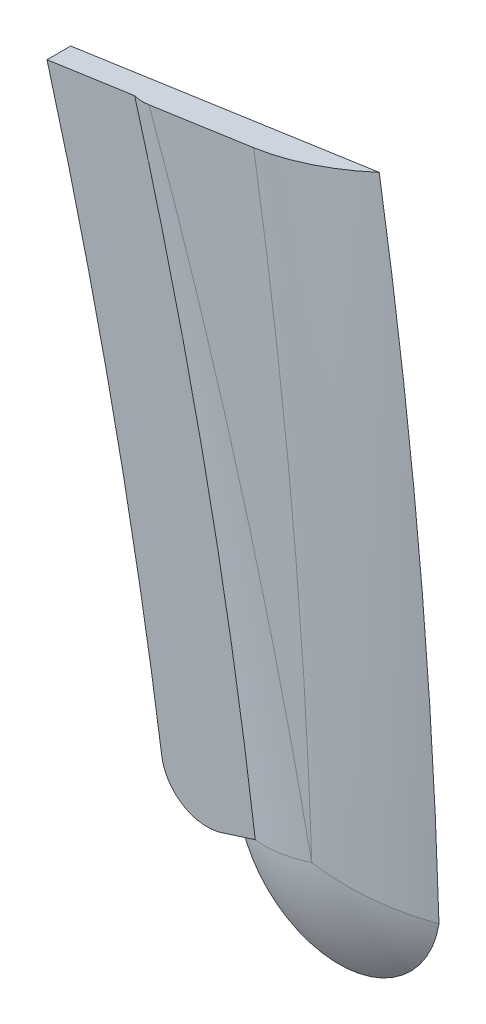
ISO-10303-21;
HEADER;
FILE_DESCRIPTION(('STEP AP214'),'2;1');
FILE_NAME('part.step','',(''),(''),'','','');
FILE_SCHEMA(('AUTOMOTIVE_DESIGN { 1 0 10303 214 1 1 1 1 }'));
ENDSEC;
DATA;
#1=APPLICATION_CONTEXT('core data for automotive mechanical design processes');
#2=APPLICATION_PROTOCOL_DEFINITION('international standard','automotive_design',2000,#1);
#3=PRODUCT_CONTEXT('',#1,'mechanical');
#4=PRODUCT('Part','Part','',(#3));
#5=PRODUCT_RELATED_PRODUCT_CATEGORY('part','',(#4));
#6=PRODUCT_DEFINITION_FORMATION('','',#4);
#7=PRODUCT_DEFINITION_CONTEXT('part definition',#1,'design');
#8=PRODUCT_DEFINITION('design','',#6,#7);
#9=PRODUCT_DEFINITION_SHAPE('','',#8);
#10=(LENGTH_UNIT() NAMED_UNIT(*) SI_UNIT(.MILLI.,.METRE.));
#11=(NAMED_UNIT(*) PLANE_ANGLE_UNIT() SI_UNIT($,.RADIAN.));
#12=(NAMED_UNIT(*) SI_UNIT($,.STERADIAN.) SOLID_ANGLE_UNIT());
#13=UNCERTAINTY_MEASURE_WITH_UNIT(LENGTH_MEASURE(1.E-05),#10,'distance_accuracy_value','');
#14=(GEOMETRIC_REPRESENTATION_CONTEXT(3) GLOBAL_UNCERTAINTY_ASSIGNED_CONTEXT((#13)) GLOBAL_UNIT_ASSIGNED_CONTEXT((#10,
#11,#12)) REPRESENTATION_CONTEXT('',''));
#15=CARTESIAN_POINT('',(0.,0.,0.));
#16=DIRECTION('',(0.,0.,1.));
#17=DIRECTION('',(1.,0.,0.));
#18=AXIS2_PLACEMENT_3D('',#15,#16,#17);
#19=CARTESIAN_POINT('',(-48.2139683042671,59.2531194314504,19.5));
#20=DIRECTION('',(0.,0.,-1.));
#21=DIRECTION('',(-1.,0.,0.));
#22=AXIS2_PLACEMENT_3D('',#19,#20,#21);
#23=PLANE('',#22);
#24=CARTESIAN_POINT('',(3.68415384016695,71.5736374912152,19.5));
#25=CARTESIAN_POINT('',(4.29468394155968,68.0185127590476,19.5));
#26=CARTESIAN_POINT('',(4.86906082283439,64.4571793651101,19.5));
#27=CARTESIAN_POINT('',(5.94508286996195,57.3235857148436,19.5));
#28=CARTESIAN_POINT('',(6.44672889729395,53.7513255884509,19.5));
#29=CARTESIAN_POINT('',(7.37687952526408,46.597276335214,19.5));
#30=CARTESIAN_POINT('',(7.80538395609168,43.0154871862663,19.5));
#31=CARTESIAN_POINT('',(8.58897757477725,35.843880383743,19.5));
#32=CARTESIAN_POINT('',(8.94406588388377,32.2540626345892,19.5));
#33=CARTESIAN_POINT('',(9.71136154316885,23.5922532149798,19.5));
#34=CARTESIAN_POINT('',(10.0871455716584,18.5169669450999,19.5));
#35=CARTESIAN_POINT('',(10.5409186123509,10.8975237956368,19.5));
#36=CARTESIAN_POINT('',(10.6738627641399,8.35650507549414,19.5));
#37=CARTESIAN_POINT('',(10.9031553748031,3.27283883682254,19.5));
#38=CARTESIAN_POINT('',(10.9995041494278,0.730191332536591,19.5));
#39=CARTESIAN_POINT('',(11.077581474908,-1.8130605800072,19.5));
#40=B_SPLINE_CURVE_WITH_KNOTS('',3,(#24,#25,#26,#27,#28,#29,#30,#31,#32,#33,#34,#35,#36,#37,#38,
#39),.UNSPECIFIED.,.F.,.F.,(4,2,2,2,2,2,2,4),(0.,10.8213143921703,21.6425005980503,
32.4637119267951,43.2850527721182,58.5501541199577,66.1834171449468,73.8166143074898),.UNSPECIFIED.);
#41=CARTESIAN_POINT('',(4.46374999870839,66.9098005966364,19.5));
#42=VERTEX_POINT('',#41);
#43=CARTESIAN_POINT('',(11.077581474908,-1.81306058000721,19.5));
#44=VERTEX_POINT('',#43);
#45=EDGE_CURVE('E188',#42,#44,#40,.T.);
#46=ORIENTED_EDGE('',*,*,#45,.T.);
#47=CARTESIAN_POINT('',(0.,0.,19.5));
#48=DIRECTION('',(0.,0.,-1.));
#49=DIRECTION('',(-1.,0.,0.));
#50=AXIS2_PLACEMENT_3D('',#47,#48,#49);
#51=CIRCLE('',#50,11.2249721603218);
#52=CARTESIAN_POINT('',(-10.7037577239821,-3.38076479310439,19.5));
#53=VERTEX_POINT('',#52);
#54=EDGE_CURVE('E138',#44,#53,#51,.T.);
#55=ORIENTED_EDGE('',*,*,#54,.T.);
#56=DIRECTION('',(-0.953566527480385,-0.301182465739626,0.));
#57=VECTOR('',#56,1.);
#58=CARTESIAN_POINT('',(0.,0.,19.5));
#59=LINE('',#58,#57);
#60=CARTESIAN_POINT('',(-11.5710273617748,-3.65469052397259,19.5));
#61=VERTEX_POINT('',#60);
#62=EDGE_CURVE('E232',#53,#61,#59,.T.);
#63=ORIENTED_EDGE('',*,*,#62,.T.);
#64=CARTESIAN_POINT('',(-13.0769396904729,1.11314211342933,19.5));
#65=DIRECTION('',(0.,0.,-1.));
#66=DIRECTION('',(-1.,0.,0.));
#67=AXIS2_PLACEMENT_3D('',#64,#65,#66);
#68=CIRCLE('',#67,5.);
#69=CARTESIAN_POINT('',(-18.0383502726661,0.493138053038172,19.5));
#70=VERTEX_POINT('',#69);
#71=EDGE_CURVE('E231',#70,#61,#68,.F.);
#72=ORIENTED_EDGE('',*,*,#71,.F.);
#73=CARTESIAN_POINT('',(-32.2537464639421,71.5736374912152,19.5));
#74=CARTESIAN_POINT('',(-31.7196254949367,69.6460921472136,19.5));
#75=CARTESIAN_POINT('',(-31.197055590972,67.7153650418235,19.5));
#76=CARTESIAN_POINT('',(-30.1751297554586,63.8477248027204,19.5));
#77=CARTESIAN_POINT('',(-29.6757744128374,61.9108115134015,19.5));
#78=CARTESIAN_POINT('',(-28.2125053871962,56.0902811987708,19.5));
#79=CARTESIAN_POINT('',(-27.2836433301346,52.1977923928441,19.5));
#80=CARTESIAN_POINT('',(-25.5202631430093,44.3913284732164,19.5));
#81=CARTESIAN_POINT('',(-24.6857494838729,40.4773523504945,19.5));
#82=CARTESIAN_POINT('',(-23.2999114318166,33.5683181958468,19.5));
#83=CARTESIAN_POINT('',(-22.7285791310125,30.5772589183038,19.5));
#84=CARTESIAN_POINT('',(-21.6411408924349,24.585056475485,19.5));
#85=CARTESIAN_POINT('',(-21.125035864776,21.58391314487,19.5));
#86=CARTESIAN_POINT('',(-20.1481588642637,15.5723653523408,19.5));
#87=CARTESIAN_POINT('',(-19.6873917913945,12.5619600944849,19.5));
#88=CARTESIAN_POINT('',(-18.8212901107604,6.53323727375859,19.5));
#89=CARTESIAN_POINT('',(-18.4159545734614,3.51491984443301,19.5));
#90=CARTESIAN_POINT('',(-18.0383502726661,0.493138053038171,19.5));
#91=B_SPLINE_CURVE_WITH_KNOTS('',3,(#73,#74,#75,#76,#77,#78,#79,#80,#81,#82,#83,#84,#85,#86,#87,
#88,#89,#90),.UNSPECIFIED.,.F.,.F.,(4,2,2,2,2,2,2,2,4),(0.,6.00046418462588,12.0010805113668,
24.0051723099705,36.0098327133338,45.1447495504336,54.2798169026959,63.4156925380838,
72.5514149547519),.UNSPECIFIED.);
#92=CARTESIAN_POINT('',(-29.6888480735039,61.9457367984052,19.5));
#93=VERTEX_POINT('',#92);
#94=EDGE_CURVE('E68',#93,#70,#91,.T.);
#95=ORIENTED_EDGE('',*,*,#94,.F.);
#96=DIRECTION('',(0.989601238153556,0.143838066745033,0.));
#97=VECTOR('',#96,1.);
#98=CARTESIAN_POINT('',(-48.2139683042671,59.2531194314504,19.5));
#99=LINE('',#98,#97);
#100=EDGE_CURVE('E11',#93,#42,#99,.T.);
#101=ORIENTED_EDGE('',*,*,#100,.T.);
#102=EDGE_LOOP('',(#46,#55,#63,#72,#95,#101));
#103=FACE_BOUND('',#102,.T.);
#104=ADVANCED_FACE('F42',(#103),#23,.T.);
#105=CARTESIAN_POINT('',(-48.2139683042671,59.2531194314504,19.5));
#106=DIRECTION('',(0.143838066745033,-0.989601238153556,0.));
#107=DIRECTION('',(0.989601238153556,0.143838066745033,0.));
#108=AXIS2_PLACEMENT_3D('',#105,#106,#107);
#109=PLANE('',#108);
#110=ORIENTED_EDGE('',*,*,#100,.F.);
#111=DIRECTION('',(0.,0.,1.));
#112=VECTOR('',#111,1.);
#113=CARTESIAN_POINT('',(-29.6888480735039,61.9457367984052,19.121468009726));
#114=LINE('',#113,#112);
#115=CARTESIAN_POINT('',(-29.688848073504,61.9457367984058,22.121468009726));
#116=VERTEX_POINT('',#115);
#117=EDGE_CURVE('E53',#93,#116,#114,.T.);
#118=ORIENTED_EDGE('',*,*,#117,.T.);
#119=CARTESIAN_POINT('',(-29.6888480731443,61.9457367974327,22.1214680096916));
#120=CARTESIAN_POINT('',(-28.8641809570097,62.0656017690125,22.1224583098839));
#121=CARTESIAN_POINT('',(-28.0395138508794,62.1854667388362,22.1234571585383));
#122=CARTESIAN_POINT('',(-26.3901796595983,62.4251966750926,22.1254724298893));
#123=CARTESIAN_POINT('',(-25.5655125744475,62.5450616415253,22.1264888525859));
#124=CARTESIAN_POINT('',(-23.1530411121093,62.8957132147051,22.1294886870414));
#125=CARTESIAN_POINT('',(-21.5652367646395,63.1264998170257,22.1314965321316));
#126=CARTESIAN_POINT('',(-19.9774324613386,63.3572864137168,22.1335395388824));
#127=B_SPLINE_CURVE_WITH_KNOTS('',3,(#119,#120,#121,#122,#123,#124,#125,#126),.UNSPECIFIED.,.F.,
.F.,(4,2,2,4),(0.,2.50000000013417,5.00000000027562,9.81347090866294),.UNSPECIFIED.);
#128=CARTESIAN_POINT('',(-19.9774324540076,63.3572864156219,22.1335395383759));
#129=VERTEX_POINT('',#128);
#130=EDGE_CURVE('E61',#116,#129,#127,.T.);
#131=ORIENTED_EDGE('',*,*,#130,.T.);
#132=CARTESIAN_POINT('',(-18.0100591429509,63.6432431842975,22.5));
#133=CARTESIAN_POINT('',(-18.1749381642348,63.6192780976828,22.5000178964002));
#134=CARTESIAN_POINT('',(-18.3398285749325,63.5953113554551,22.4926534423389));
#135=CARTESIAN_POINT('',(-18.6681651530286,63.547587790924,22.4631371498533));
#136=CARTESIAN_POINT('',(-18.8316124242347,63.5238308081827,22.4409978267322));
#137=CARTESIAN_POINT('',(-19.1607756524919,63.4759870903337,22.3810170029243));
#138=CARTESIAN_POINT('',(-19.3264110505971,63.4519120644312,22.3427214831163));
#139=CARTESIAN_POINT('',(-19.6548538859439,63.4041730553858,22.2501669322395));
#140=CARTESIAN_POINT('',(-19.8176226353788,63.3805146954969,22.1957678060347));
#141=CARTESIAN_POINT('',(-19.9774324460607,63.3572864159211,22.1335395379139));
#142=B_SPLINE_CURVE_WITH_KNOTS('',3,(#132,#133,#134,#135,#136,#137,#138,#139,#140,#141),
.UNSPECIFIED.,.F.,.F.,(4,2,2,2,4),(0.,0.499687675942111,0.998952619310689,1.51329554841847,
2.03225158587927),.UNSPECIFIED.);
#143=CARTESIAN_POINT('',(-18.0100591428874,63.6432431838606,22.5));
#144=VERTEX_POINT('',#143);
#145=EDGE_CURVE('E201',#144,#129,#142,.T.);
#146=ORIENTED_EDGE('',*,*,#145,.F.);
#147=DIRECTION('',(0.989601238153556,0.143838066745033,0.));
#148=VECTOR('',#147,1.);
#149=CARTESIAN_POINT('',(-6.9765973767258,65.246951576338,22.5));
#150=LINE('',#149,#148);
#151=CARTESIAN_POINT('',(-6.43551568830894,65.325597544698,22.5));
#152=VERTEX_POINT('',#151);
#153=EDGE_CURVE('E133',#144,#152,#150,.T.);
#154=ORIENTED_EDGE('',*,*,#153,.T.);
#155=CARTESIAN_POINT('',(4.46374999870449,66.9098005966604,19.5));
#156=CARTESIAN_POINT('',(4.19956416827798,66.8714013125398,19.6565568907055));
#157=CARTESIAN_POINT('',(3.93214175863432,66.8325315931776,19.80746078965));
#158=CARTESIAN_POINT('',(3.39121958883246,66.7539088144622,20.0977150897424));
#159=CARTESIAN_POINT('',(3.11771971747473,66.7141557389462,20.2370652792705));
#160=CARTESIAN_POINT('',(2.28865799074981,66.5936520134184,20.6374319510333));
#161=CARTESIAN_POINT('',(1.7245861474829,66.5116644407349,20.8807336419089));
#162=CARTESIAN_POINT('',(0.59065252817409,66.3468477314077,21.3131983589776));
#163=CARTESIAN_POINT('',(0.0211867542966368,66.2640761534893,21.5034284310159));
#164=CARTESIAN_POINT('',(-1.13131947692903,66.0965599239013,21.8351928326847));
#165=CARTESIAN_POINT('',(-1.71435431136122,66.0118160895198,21.9767469627244));
#166=CARTESIAN_POINT('',(-2.64010137917313,65.8772591958994,22.1605211289467));
#167=CARTESIAN_POINT('',(-2.97966605898506,65.8279036320663,22.2193920776497));
#168=CARTESIAN_POINT('',(-3.66116348459517,65.7288483071411,22.3205458109786));
#169=CARTESIAN_POINT('',(-4.00309576616155,65.6791486135249,22.3628317587687));
#170=CARTESIAN_POINT('',(-4.69295730555389,65.578877568662,22.4311414030625));
#171=CARTESIAN_POINT('',(-5.04090734242944,65.5283031971902,22.4569502663708));
#172=CARTESIAN_POINT('',(-5.73774222336155,65.4270185804663,22.4913859345215));
#173=CARTESIAN_POINT('',(-6.08662731377471,65.3763082994061,22.5000076479176));
#174=CARTESIAN_POINT('',(-6.43551568771964,65.3255975410819,22.5));
#175=B_SPLINE_CURVE_WITH_KNOTS('',3,(#155,#156,#157,#158,#159,#160,#161,#162,#163,#164,#165,
#166,#167,#168,#169,#170,#171,#172,#173,#174),.UNSPECIFIED.,.F.,.F.,(4,2,2,2,2,2,2,2,2,4),(0.,
0.928297783112485,1.85661256533015,3.71342473248062,5.52965387110042,7.34514332726703,
8.38923478655614,9.43312701518834,10.4903659122269,11.5479179545856),.UNSPECIFIED.);
#176=EDGE_CURVE('E112',#42,#152,#175,.T.);
#177=ORIENTED_EDGE('',*,*,#176,.F.);
#178=EDGE_LOOP('',(#110,#118,#131,#146,#154,#177));
#179=FACE_BOUND('',#178,.T.);
#180=ADVANCED_FACE('F178',(#179),#109,.F.);
#181=CARTESIAN_POINT('',(-9.74809453416287,83.5993573447297,22.5));
#182=CARTESIAN_POINT('',(-4.22785944517301,55.9498439428343,22.5));
#183=CARTESIAN_POINT('',(-0.978494600203497,28.0833914947117,22.5));
#184=CARTESIAN_POINT('',(0.,0.,22.5));
#185=CARTESIAN_POINT('',(35.2519054658371,83.5993573447297,22.5));
#186=CARTESIAN_POINT('',(40.7722285920956,53.5347025802419,22.5));
#187=CARTESIAN_POINT('',(43.8232734863236,23.2143554142726,22.5));
#188=CARTESIAN_POINT('',(44.4091227355495,-7.26841233412778,22.5));
#189=CARTESIAN_POINT('',(35.2519054658371,83.5993573447297,-22.5));
#190=CARTESIAN_POINT('',(40.7722285920956,53.5347025802419,-22.5));
#191=CARTESIAN_POINT('',(43.8232734863236,23.2143554142726,-22.5));
#192=CARTESIAN_POINT('',(44.4091227355495,-7.26841233412778,-22.5));
#193=CARTESIAN_POINT('',(-9.74809453416286,83.5993573447297,-22.5));
#194=CARTESIAN_POINT('',(-4.22785944517299,55.9498439428342,-22.5));
#195=CARTESIAN_POINT('',(-0.978494600203495,28.0833914947118,-22.5));
#196=CARTESIAN_POINT('',(0.,0.,-22.5));
#197=(BOUNDED_SURFACE() B_SPLINE_SURFACE(3,3,((#181,#182,#183,#184),(#185,#186,#187,#188),(#189,
#190,#191,#192),(#193,#194,#195,#196)),.UNSPECIFIED.,.F.,.F.,
.F.) B_SPLINE_SURFACE_WITH_KNOTS((4,4),(4,4),(0.,1.),(0.,1.),
.UNSPECIFIED.) GEOMETRIC_REPRESENTATION_ITEM() RATIONAL_B_SPLINE_SURFACE(((1.,1.,1.,1.),
(0.333333333333333,0.333333333333333,0.333333333333333,0.333333333333333),(0.333333333333333,
0.333333333333333,0.333333333333333,0.333333333333333),(1.,1.,1.,1.))) REPRESENTATION_ITEM('') SURFACE());
#198=CARTESIAN_POINT('',(-9.74809453416287,83.5993573447297,22.5));
#199=CARTESIAN_POINT('',(-4.22785944517301,55.9498439428343,22.5));
#200=CARTESIAN_POINT('',(-0.978494600203497,28.0833914947117,22.5));
#201=CARTESIAN_POINT('',(0.,0.,22.5));
#202=B_SPLINE_CURVE_WITH_KNOTS('',3,(#198,#199,#200,#201),.UNSPECIFIED.,.F.,.F.,(4,4),(0.,1.),.UNSPECIFIED.);
#203=CARTESIAN_POINT('',(0.,0.,22.5));
#204=VERTEX_POINT('',#203);
#205=EDGE_CURVE('E106',#152,#204,#202,.T.);
#206=CARTESIAN_POINT('',(0.,0.,0.));
#207=DIRECTION('',(0.161520274091728,0.986869394123322,0.));
#208=DIRECTION('',(0.,0.,1.));
#209=AXIS2_PLACEMENT_3D('',#206,#207,#208);
#210=CIRCLE('',#209,22.5);
#211=EDGE_CURVE('E110',#204,#44,#210,.T.);
#212=ORIENTED_EDGE('',*,*,#45,.F.);
#213=ORIENTED_EDGE('',*,*,#176,.T.);
#214=ORIENTED_EDGE('',*,*,#205,.T.);
#215=ORIENTED_EDGE('',*,*,#211,.T.);
#216=EDGE_LOOP('',(#212,#213,#214,#215));
#217=FACE_BOUND('',#216,.T.);
#218=ADVANCED_FACE('F108',(#217),#197,.F.);
#219=CARTESIAN_POINT('',(-2.0337087607345,31.2400380719264,22.5));
#220=DIRECTION('',(0.,0.,1.));
#221=DIRECTION('',(1.,0.,0.));
#222=AXIS2_PLACEMENT_3D('',#219,#220,#221);
#223=PLANE('',#222);
#224=ORIENTED_EDGE('',*,*,#153,.F.);
#225=CARTESIAN_POINT('',(0.,0.,22.5));
#226=CARTESIAN_POINT('',(-5.84828609658728,28.3772270638864,22.5));
#227=CARTESIAN_POINT('',(-14.4309842886617,56.2436795574777,22.5));
#228=CARTESIAN_POINT('',(-25.7480945761217,83.5993574805807,22.5));
#229=B_SPLINE_CURVE_WITH_KNOTS('',3,(#225,#226,#227,#228),.UNSPECIFIED.,.F.,.F.,(4,4),(0.,1.),.UNSPECIFIED.);
#230=EDGE_CURVE('E124',#204,#144,#229,.T.);
#231=ORIENTED_EDGE('',*,*,#230,.F.);
#232=ORIENTED_EDGE('',*,*,#205,.F.);
#233=EDGE_LOOP('',(#224,#231,#232));
#234=FACE_BOUND('',#233,.T.);
#235=ADVANCED_FACE('F132',(#234),#223,.T.);
#236=CARTESIAN_POINT('',(0.,0.,0.));
#237=DIRECTION('',(0.,0.,1.));
#238=DIRECTION('',(-0.953566527480384,-0.301182465739626,0.));
#239=AXIS2_PLACEMENT_3D('',#236,#237,#238);
#240=SPHERICAL_SURFACE('',#239,22.5);
#241=ORIENTED_EDGE('',*,*,#54,.F.);
#242=ORIENTED_EDGE('',*,*,#211,.F.);
#243=CARTESIAN_POINT('',(0.,0.,0.));
#244=DIRECTION('',(-0.301182465739626,0.953566527480384,0.));
#245=DIRECTION('',(-0.953566527480384,-0.301182465739626,0.));
#246=AXIS2_PLACEMENT_3D('',#243,#244,#245);
#247=CIRCLE('',#246,22.5);
#248=CARTESIAN_POINT('',(-7.79355907261923,-2.46158319397089,20.9630876819412));
#249=VERTEX_POINT('',#248);
#250=EDGE_CURVE('E116',#249,#204,#247,.T.);
#251=ORIENTED_EDGE('',*,*,#250,.F.);
#252=CARTESIAN_POINT('',(0.,0.,0.));
#253=DIRECTION('',(-0.301182465739626,0.953566527480385,0.));
#254=DIRECTION('',(-0.953566527480384,-0.301182465739626,0.));
#255=AXIS2_PLACEMENT_3D('',#252,#253,#254);
#256=CIRCLE('',#255,22.5);
#257=EDGE_CURVE('E221',#53,#249,#256,.T.);
#258=ORIENTED_EDGE('',*,*,#257,.F.);
#259=EDGE_LOOP('',(#241,#242,#251,#258));
#260=FACE_BOUND('',#259,.T.);
#261=ADVANCED_FACE('F136',(#260),#240,.T.);
#262=CARTESIAN_POINT('',(-7.79355907261923,-2.46158319397088,20.9630876819412));
#263=CARTESIAN_POINT('',(-11.0439921450001,26.7361716012391,21.4753917879608));
#264=CARTESIAN_POINT('',(-17.0288373128681,55.4231518261541,21.9876958939804));
#265=CARTESIAN_POINT('',(-25.7480945761217,83.5993574805807,22.5));
#266=CARTESIAN_POINT('',(-7.17429346950012,-2.26598914162094,21.2162829255134));
#267=CARTESIAN_POINT('',(-10.6311484095874,26.8665676361391,21.644188617009));
#268=CARTESIAN_POINT('',(-16.8224154451617,55.4883498436041,22.0720943085045));
#269=CARTESIAN_POINT('',(-25.7480945761217,83.5993574805807,22.5));
#270=CARTESIAN_POINT('',(-5.91330955980664,-1.86770938637094,21.6622783991942));
#271=CARTESIAN_POINT('',(-9.7904924697917,27.1320874729724,21.9415189327962));
#272=CARTESIAN_POINT('',(-16.4020874752639,55.6211097620207,22.2207594663981));
#273=CARTESIAN_POINT('',(-25.7480945761217,83.5993574805807,22.5));
#274=CARTESIAN_POINT('',(-3.97079084835597,-1.25416795176758,22.1442898168403));
#275=CARTESIAN_POINT('',(-8.49547999549125,27.5411150960413,22.2628598778935));
#276=CARTESIAN_POINT('',(-15.7545812381137,55.8256235735552,22.3814299389468));
#277=CARTESIAN_POINT('',(-25.7480945761217,83.5993574805807,22.5));
#278=CARTESIAN_POINT('',(-1.99400086928696,-0.629801991986504,22.4351773723857));
#279=CARTESIAN_POINT('',(-7.17762000944524,27.9573590692287,22.4567849149238));
#280=CARTESIAN_POINT('',(-15.0956512450907,56.0337455601489,22.4783924574619));
#281=CARTESIAN_POINT('',(-25.7480945761217,83.5993574805807,22.5));
#282=CARTESIAN_POINT('',(-0.664667165523677,-0.20993406337106,22.5));
#283=CARTESIAN_POINT('',(-6.29139754026972,28.237271021639,22.5));
#284=CARTESIAN_POINT('',(-14.6525400105029,56.173701536354,22.5));
#285=CARTESIAN_POINT('',(-25.7480945761217,83.5993574805807,22.5));
#286=CARTESIAN_POINT('',(0.,0.,22.5));
#287=CARTESIAN_POINT('',(-5.84828609658728,28.3772270638864,22.5));
#288=CARTESIAN_POINT('',(-14.4309842886617,56.2436795574777,22.5));
#289=CARTESIAN_POINT('',(-25.7480945761217,83.5993574805807,22.5));
#290=B_SPLINE_SURFACE_WITH_KNOTS('',3,3,((#262,#263,#264,#265),(#266,#267,#268,#269),(#270,#271,
#272,#273),(#274,#275,#276,#277),(#278,#279,#280,#281),(#282,#283,#284,#285),(#286,#287,#288,
#289)),.UNSPECIFIED.,.F.,.F.,.F.,(4,1,1,1,4),(4,4),(0.0850326956653399,0.200726830291187,
0.316420964917035,0.432115099542882,0.54780923416873),(0.,1.),.UNSPECIFIED.);
#291=CARTESIAN_POINT('',(-7.79355907261923,-2.46158319397088,20.9630876819412));
#292=CARTESIAN_POINT('',(-11.0439921450001,26.7361716012391,21.4753917879608));
#293=CARTESIAN_POINT('',(-17.0288373128681,55.4231518261541,21.9876958939804));
#294=CARTESIAN_POINT('',(-25.7480945761217,83.5993574805807,22.5));
#295=B_SPLINE_CURVE_WITH_KNOTS('',3,(#291,#292,#293,#294),.UNSPECIFIED.,.F.,.F.,(4,4),(0.,1.),.UNSPECIFIED.);
#296=EDGE_CURVE('E46',#249,#129,#295,.T.);
#297=ORIENTED_EDGE('',*,*,#230,.T.);
#298=ORIENTED_EDGE('',*,*,#145,.T.);
#299=ORIENTED_EDGE('',*,*,#296,.F.);
#300=ORIENTED_EDGE('',*,*,#250,.T.);
#301=EDGE_LOOP('',(#297,#298,#299,#300));
#302=FACE_BOUND('',#301,.T.);
#303=ADVANCED_FACE('F123',(#302),#290,.T.);
#304=CARTESIAN_POINT('',(-35.7480945342819,83.5993573447297,22.5));
#305=CARTESIAN_POINT('',(-26.8740590432428,54.4192102736887,21.9876958939804));
#306=CARTESIAN_POINT('',(-20.7344356475894,24.7282884963083,21.4753917879608));
#307=CARTESIAN_POINT('',(-17.3292243474231,-5.47340785136715,20.9630876819412));
#308=CARTESIAN_POINT('',(-34.9147612044352,83.5993573447297,22.5));
#309=CARTESIAN_POINT('',(-26.0536238990449,54.5028720697275,21.9876958939804));
#310=CARTESIAN_POINT('',(-19.9268986890403,24.8956120883858,21.4753917879608));
#311=CARTESIAN_POINT('',(-16.5345855745228,-5.2224224632508,20.9630876819412));
#312=CARTESIAN_POINT('',(-33.2480945447419,83.5993573447297,22.5));
#313=CARTESIAN_POINT('',(-24.4127536106492,54.670195661805,21.9876958939804));
#314=CARTESIAN_POINT('',(-18.3118247719421,25.230259272541,21.4753917879608));
#315=CARTESIAN_POINT('',(-14.9453080287221,-4.72045168701809,20.9630876819412));
#316=CARTESIAN_POINT('',(-30.7480945552018,83.5993573447297,22.5));
#317=CARTESIAN_POINT('',(-21.9514481780554,54.9211810499214,21.9876958939804));
#318=CARTESIAN_POINT('',(-15.8892138962947,25.7322300487737,21.4753917879608));
#319=CARTESIAN_POINT('',(-12.5613917100212,-3.96749552266903,20.9630876819412));
#320=CARTESIAN_POINT('',(-28.2480945656618,83.5993573447297,22.5));
#321=CARTESIAN_POINT('',(-19.4901427454618,55.1721664380378,21.9876958939804));
#322=CARTESIAN_POINT('',(-13.4666030206474,26.2342008250064,21.4753917879608));
#323=CARTESIAN_POINT('',(-10.1774753913202,-3.21453935831995,20.9630876819412));
#324=CARTESIAN_POINT('',(-26.5814279059684,83.5993573447297,22.5));
#325=CARTESIAN_POINT('',(-17.849272457066,55.3394900301153,21.9876958939804));
#326=CARTESIAN_POINT('',(-11.8515291035492,26.5688480091615,21.4753917879608));
#327=CARTESIAN_POINT('',(-8.58819784551955,-2.71256858208725,20.9630876819412));
#328=CARTESIAN_POINT('',(-25.7480945761217,83.5993573447297,22.5));
#329=CARTESIAN_POINT('',(-17.0288373128681,55.4231518261541,21.9876958939804));
#330=CARTESIAN_POINT('',(-11.0439921450001,26.7361716012391,21.4753917879608));
#331=CARTESIAN_POINT('',(-7.79355907261923,-2.46158319397089,20.9630876819412));
#332=B_SPLINE_SURFACE_WITH_KNOTS('',3,3,((#304,#305,#306,#307),(#308,#309,#310,#311),(#312,#313,
#314,#315),(#316,#317,#318,#319),(#320,#321,#322,#323),(#324,#325,#326,#327),(#328,#329,#330,
#331)),.UNSPECIFIED.,.F.,.F.,.F.,(4,1,1,1,4),(4,4),(0.687500000245155,0.765625000183866,
0.843750000122578,0.921875000061289,1.),(0.,1.),.UNSPECIFIED.);
#333=CARTESIAN_POINT('',(-35.7480945342819,83.5993573447297,22.5));
#334=CARTESIAN_POINT('',(-26.8740590432428,54.4192102736887,21.9876958939804));
#335=CARTESIAN_POINT('',(-20.7344356475894,24.7282884963083,21.4753917879608));
#336=CARTESIAN_POINT('',(-17.3292243474231,-5.47340785136715,20.9630876819412));
#337=B_SPLINE_CURVE_WITH_KNOTS('',3,(#333,#334,#335,#336),.UNSPECIFIED.,.F.,.F.,(4,4),(0.,1.),.UNSPECIFIED.);
#338=CARTESIAN_POINT('',(-18.0383502726661,0.493138053038173,21.0644097324024));
#339=VERTEX_POINT('',#338);
#340=EDGE_CURVE('E288',#116,#339,#337,.T.);
#341=CARTESIAN_POINT('',(-18.0383502726661,0.493138053038173,21.0644097324024));
#342=CARTESIAN_POINT('',(-18.0209251190671,0.353576229150639,21.062037163367));
#343=CARTESIAN_POINT('',(-17.9975823697202,0.21475637692507,21.059648118478));
#344=CARTESIAN_POINT('',(-17.9392943483595,-0.0604188447387884,21.0548533975472));
#345=CARTESIAN_POINT('',(-17.9043496312325,-0.196774331711365,21.052447722306));
#346=CARTESIAN_POINT('',(-17.8231168690187,-0.465960247792306,21.0476375032546));
#347=CARTESIAN_POINT('',(-17.7768367240002,-0.59879306082869,21.04523295982));
#348=CARTESIAN_POINT('',(-17.6732547015626,-0.860087786171497,21.0404395932403));
#349=CARTESIAN_POINT('',(-17.6159529580511,-0.98854975155949,21.0380507699046));
#350=CARTESIAN_POINT('',(-17.4907156997806,-1.24022653358693,21.0333043183323));
#351=CARTESIAN_POINT('',(-17.422777232553,-1.36343988123538,21.0309466989547));
#352=CARTESIAN_POINT('',(-17.2767341261882,-1.60375007616942,21.0262784980351));
#353=CARTESIAN_POINT('',(-17.1986257408629,-1.7208446471605,21.023967934191));
#354=CARTESIAN_POINT('',(-17.0328636613694,-1.94797217261096,21.0194118068832));
#355=CARTESIAN_POINT('',(-16.9452152778096,-2.05800900221306,21.017166208128));
#356=CARTESIAN_POINT('',(-16.7609265270309,-2.27034881174661,21.012753298772));
#357=CARTESIAN_POINT('',(-16.6642828632283,-2.37264893124199,21.0105860172801));
#358=CARTESIAN_POINT('',(-16.4627514956855,-2.56871008465337,21.0063463379553));
#359=CARTESIAN_POINT('',(-16.3578665404683,-2.66247394313573,21.0042739088504));
#360=CARTESIAN_POINT('',(-16.1405319255144,-2.84086520905664,21.0002369389559));
#361=CARTESIAN_POINT('',(-16.0280796471735,-2.92548942714239,20.9982724359447));
#362=CARTESIAN_POINT('',(-15.7964547318157,-3.0849533594053,20.9944661631707));
#363=CARTESIAN_POINT('',(-15.6772827985108,-3.15979409543817,20.9926243805999));
#364=CARTESIAN_POINT('',(-15.4330551716328,-3.29916883904331,20.9890764677568));
#365=CARTESIAN_POINT('',(-15.307999479289,-3.36370284876928,20.987370337456));
#366=CARTESIAN_POINT('',(-15.052914703064,-3.48199496691891,20.9841063307739));
#367=CARTESIAN_POINT('',(-14.922886446949,-3.53575485965616,20.9825484298666));
#368=CARTESIAN_POINT('',(-14.6588074518878,-3.63211269176272,20.9795924974762));
#369=CARTESIAN_POINT('',(-14.5247581275257,-3.67471450631237,20.9781944105854));
#370=CARTESIAN_POINT('',(-14.253445968268,-3.7485048707358,20.9755669241395));
#371=CARTESIAN_POINT('',(-14.1161808322669,-3.7796849647364,20.9743376499813));
#372=CARTESIAN_POINT('',(-13.8395605516137,-3.83035600255832,20.9720587869087));
#373=CARTESIAN_POINT('',(-13.7002061954649,-3.84985124797622,20.971009131972));
#374=CARTESIAN_POINT('',(-13.4202054525179,-3.87704569494871,20.969096148936));
#375=CARTESIAN_POINT('',(-13.2795578839873,-3.88473274023792,20.9682330136386));
#376=CARTESIAN_POINT('',(-12.9981665412107,-3.88821612394121,20.9667016875948));
#377=CARTESIAN_POINT('',(-12.8574228239715,-3.88401698783979,20.9660334227612));
#378=CARTESIAN_POINT('',(-12.5770049886681,-3.86378468196442,20.964897877447));
#379=CARTESIAN_POINT('',(-12.4373295880971,-3.84776917735898,20.9644302985946));
#380=CARTESIAN_POINT('',(-12.1598817625355,-3.80404280201353,20.9636991072243));
#381=CARTESIAN_POINT('',(-12.0221082739603,-3.77633876604826,20.963435375763));
#382=CARTESIAN_POINT('',(-11.8328260969823,-3.72991048467707,20.9632124487138));
#383=CARTESIAN_POINT('',(-11.7800863988123,-3.71605512488602,20.9631656475684));
#384=CARTESIAN_POINT('',(-11.6751533704365,-3.6866452393293,20.9631032863664));
#385=CARTESIAN_POINT('',(-11.6229594442016,-3.67109284027163,20.9630876876709));
#386=CARTESIAN_POINT('',(-11.5710273617748,-3.65469052397259,20.9630876819412));
#387=B_SPLINE_CURVE_WITH_KNOTS('',3,(#341,#342,#343,#344,#345,#346,#347,#348,#349,#350,#351,
#352,#353,#354,#355,#356,#357,#358,#359,#360,#361,#362,#363,#364,#365,#366,#367,#368,#369,#370,
#371,#372,#373,#374,#375,#376,#377,#378,#379,#380,#381,#382,#383,#384,#385,#386),.UNSPECIFIED.,
.F.,.F.,(4,2,2,2,2,2,2,2,2,2,2,2,2,2,2,2,2,2,2,2,2,2,4),(0.,0.421867525943038,0.84371487815219,
1.26526906214492,1.68681812476243,2.10848440620336,2.53030645429641,2.95189487715341,
3.37363841637747,3.79524189363769,4.21699202076032,4.63869806207551,5.06040401527073,
5.48204007145345,5.9035294994431,6.32533034218824,6.7469758099397,7.16905506160052,
7.59097363456235,8.01226272486072,8.43330581042817,8.59687098861085,8.76023349333742),.UNSPECIFIED.);
#388=CARTESIAN_POINT('',(-11.5710273617748,-3.65469052397259,20.9630876819412));
#389=VERTEX_POINT('',#388);
#390=EDGE_CURVE('E280',#339,#389,#387,.T.);
#391=CARTESIAN_POINT('',(-17.3292243474231,-5.47340785136715,20.9630876819412));
#392=CARTESIAN_POINT('',(-16.5345855745228,-5.2224224632508,20.9630876819412));
#393=CARTESIAN_POINT('',(-14.9453080287221,-4.72045168701809,20.9630876819412));
#394=CARTESIAN_POINT('',(-12.5613917100212,-3.96749552266903,20.9630876819412));
#395=CARTESIAN_POINT('',(-10.1774753913202,-3.21453935831995,20.9630876819412));
#396=CARTESIAN_POINT('',(-8.58819784551955,-2.71256858208725,20.9630876819412));
#397=CARTESIAN_POINT('',(-7.79355907261923,-2.46158319397089,20.9630876819412));
#398=B_SPLINE_CURVE_WITH_KNOTS('',3,(#391,#392,#393,#394,#395,#396,#397),.UNSPECIFIED.,.F.,.F.,
(4,1,1,1,4),(0.687500000245155,0.765625000183866,0.843750000122578,0.921875000061289,1.),.UNSPECIFIED.);
#399=EDGE_CURVE('E290',#249,#389,#398,.F.);
#400=ORIENTED_EDGE('',*,*,#130,.F.);
#401=ORIENTED_EDGE('',*,*,#340,.T.);
#402=ORIENTED_EDGE('',*,*,#390,.T.);
#403=ORIENTED_EDGE('',*,*,#399,.F.);
#404=ORIENTED_EDGE('',*,*,#296,.T.);
#405=EDGE_LOOP('',(#400,#401,#402,#403,#404));
#406=FACE_BOUND('',#405,.T.);
#407=ADVANCED_FACE('F240',(#406),#332,.F.);
#408=CARTESIAN_POINT('',(0.,0.,0.));
#409=DIRECTION('',(-0.301182465739626,0.953566527480385,0.));
#410=DIRECTION('',(-0.953566527480384,-0.301182465739626,0.));
#411=AXIS2_PLACEMENT_3D('',#408,#409,#410);
#412=PLANE('',#411);
#413=ORIENTED_EDGE('',*,*,#62,.F.);
#414=ORIENTED_EDGE('',*,*,#257,.T.);
#415=ORIENTED_EDGE('',*,*,#399,.T.);
#416=DIRECTION('',(0.,0.,-1.));
#417=VECTOR('',#416,1.);
#418=CARTESIAN_POINT('',(-11.5710273617748,-3.65469052397259,14.9630876819412));
#419=LINE('',#418,#417);
#420=EDGE_CURVE('E140',#389,#61,#419,.T.);
#421=ORIENTED_EDGE('',*,*,#420,.T.);
#422=EDGE_LOOP('',(#413,#414,#415,#421));
#423=FACE_BOUND('',#422,.T.);
#424=ADVANCED_FACE('F238',(#423),#412,.F.);
#425=CARTESIAN_POINT('',(-35.7480945342819,83.5993573447297,16.5));
#426=CARTESIAN_POINT('',(-26.8740590432428,54.4192102736887,15.9876958939804));
#427=CARTESIAN_POINT('',(-20.7344356475894,24.7282884963083,15.4753917879608));
#428=CARTESIAN_POINT('',(-17.3292243474231,-5.47340785136716,14.9630876819412));
#429=CARTESIAN_POINT('',(-35.7480945342819,83.5993573447297,17.));
#430=CARTESIAN_POINT('',(-26.8740590432428,54.4192102736887,16.4876958939804));
#431=CARTESIAN_POINT('',(-20.7344356475894,24.7282884963083,15.9753917879608));
#432=CARTESIAN_POINT('',(-17.3292243474231,-5.47340785136716,15.4630876819412));
#433=CARTESIAN_POINT('',(-35.7480945342819,83.5993573447297,18.));
#434=CARTESIAN_POINT('',(-26.8740590432428,54.4192102736887,17.4876958939804));
#435=CARTESIAN_POINT('',(-20.7344356475894,24.7282884963082,16.9753917879608));
#436=CARTESIAN_POINT('',(-17.3292243474231,-5.47340785136716,16.4630876819412));
#437=CARTESIAN_POINT('',(-35.7480945342819,83.5993573447298,19.5));
#438=CARTESIAN_POINT('',(-26.8740590432428,54.4192102736887,18.9876958939804));
#439=CARTESIAN_POINT('',(-20.7344356475894,24.7282884963083,18.4753917879608));
#440=CARTESIAN_POINT('',(-17.3292243474231,-5.47340785136715,17.9630876819412));
#441=CARTESIAN_POINT('',(-35.7480945342819,83.5993573447296,21.));
#442=CARTESIAN_POINT('',(-26.8740590432428,54.4192102736886,20.4876958939804));
#443=CARTESIAN_POINT('',(-20.7344356475894,24.7282884963082,19.9753917879608));
#444=CARTESIAN_POINT('',(-17.3292243474231,-5.47340785136716,19.4630876819412));
#445=CARTESIAN_POINT('',(-35.7480945342819,83.5993573447297,22.));
#446=CARTESIAN_POINT('',(-26.8740590432428,54.4192102736887,21.4876958939804));
#447=CARTESIAN_POINT('',(-20.7344356475894,24.7282884963083,20.9753917879608));
#448=CARTESIAN_POINT('',(-17.3292243474231,-5.47340785136715,20.4630876819412));
#449=CARTESIAN_POINT('',(-35.7480945342819,83.5993573447297,22.5));
#450=CARTESIAN_POINT('',(-26.8740590432428,54.4192102736887,21.9876958939804));
#451=CARTESIAN_POINT('',(-20.7344356475894,24.7282884963083,21.4753917879608));
#452=CARTESIAN_POINT('',(-17.3292243474231,-5.47340785136715,20.9630876819412));
#453=B_SPLINE_SURFACE_WITH_KNOTS('',3,3,((#425,#426,#427,#428),(#429,#430,#431,#432),(#433,#434,
#435,#436),(#437,#438,#439,#440),(#441,#442,#443,#444),(#445,#446,#447,#448),(#449,#450,#451,
#452)),.UNSPECIFIED.,.F.,.F.,.F.,(4,1,1,1,4),(4,4),(0.5,0.546875000061289,0.593750000122578,
0.640625000183866,0.687500000245155),(0.,1.),.UNSPECIFIED.);
#454=DIRECTION('',(0.,0.,1.));
#455=VECTOR('',#454,1.);
#456=CARTESIAN_POINT('',(-18.0383502726661,0.493138053038172,15.0644097324024));
#457=LINE('',#456,#455);
#458=EDGE_CURVE('E143',#70,#339,#457,.T.);
#459=ORIENTED_EDGE('',*,*,#117,.F.);
#460=ORIENTED_EDGE('',*,*,#94,.T.);
#461=ORIENTED_EDGE('',*,*,#458,.T.);
#462=ORIENTED_EDGE('',*,*,#340,.F.);
#463=EDGE_LOOP('',(#459,#460,#461,#462));
#464=FACE_BOUND('',#463,.T.);
#465=ADVANCED_FACE('F233',(#464),#453,.F.);
#466=CARTESIAN_POINT('',(-13.0769396904729,1.11314211342933,17.9630876819412));
#467=DIRECTION('',(0.,0.,1.));
#468=DIRECTION('',(1.,0.,0.));
#469=AXIS2_PLACEMENT_3D('',#466,#467,#468);
#470=CYLINDRICAL_SURFACE('',#469,5.);
#471=ORIENTED_EDGE('',*,*,#458,.F.);
#472=ORIENTED_EDGE('',*,*,#71,.T.);
#473=ORIENTED_EDGE('',*,*,#420,.F.);
#474=ORIENTED_EDGE('',*,*,#390,.F.);
#475=EDGE_LOOP('',(#471,#472,#473,#474));
#476=FACE_BOUND('',#475,.T.);
#477=ADVANCED_FACE('F179',(#476),#470,.T.);
#478=CLOSED_SHELL('',(#104,#180,#218,#235,#261,#303,#407,#424,#465,#477));
#479=MANIFOLD_SOLID_BREP('B2',#478);
#480=ADVANCED_BREP_SHAPE_REPRESENTATION('',(#18,#479),#14);
#481=SHAPE_DEFINITION_REPRESENTATION(#9,#480);
ENDSEC;
END-ISO-10303-21;
